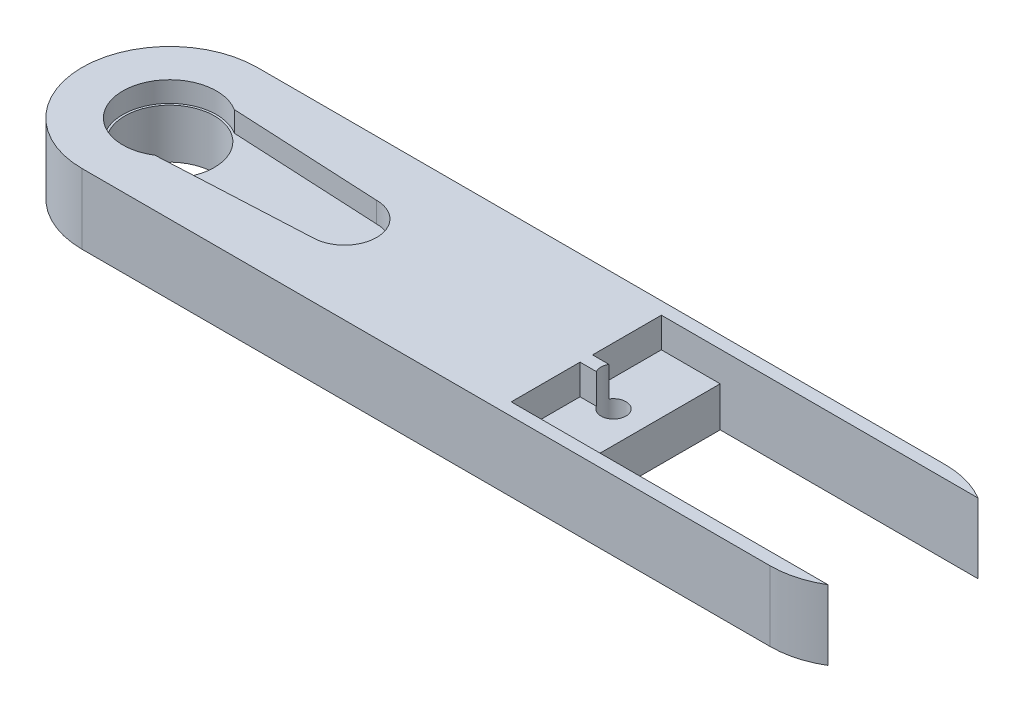
ISO-10303-21;
HEADER;
FILE_DESCRIPTION(('STEP AP214'),'2;1');
FILE_NAME('part.step','',(''),(''),'','','');
FILE_SCHEMA(('AUTOMOTIVE_DESIGN { 1 0 10303 214 1 1 1 1 }'));
ENDSEC;
DATA;
#1=APPLICATION_CONTEXT('core data for automotive mechanical design processes');
#2=APPLICATION_PROTOCOL_DEFINITION('international standard','automotive_design',2000,#1);
#3=PRODUCT_CONTEXT('',#1,'mechanical');
#4=PRODUCT('Part','Part','',(#3));
#5=PRODUCT_RELATED_PRODUCT_CATEGORY('part','',(#4));
#6=PRODUCT_DEFINITION_FORMATION('','',#4);
#7=PRODUCT_DEFINITION_CONTEXT('part definition',#1,'design');
#8=PRODUCT_DEFINITION('design','',#6,#7);
#9=PRODUCT_DEFINITION_SHAPE('','',#8);
#10=(LENGTH_UNIT() NAMED_UNIT(*) SI_UNIT(.MILLI.,.METRE.));
#11=(NAMED_UNIT(*) PLANE_ANGLE_UNIT() SI_UNIT($,.RADIAN.));
#12=(NAMED_UNIT(*) SI_UNIT($,.STERADIAN.) SOLID_ANGLE_UNIT());
#13=UNCERTAINTY_MEASURE_WITH_UNIT(LENGTH_MEASURE(1.E-05),#10,'distance_accuracy_value','');
#14=(GEOMETRIC_REPRESENTATION_CONTEXT(3) GLOBAL_UNCERTAINTY_ASSIGNED_CONTEXT((#13)) GLOBAL_UNIT_ASSIGNED_CONTEXT((#10,
#11,#12)) REPRESENTATION_CONTEXT('',''));
#15=CARTESIAN_POINT('',(0.,0.,0.));
#16=DIRECTION('',(0.,0.,1.));
#17=DIRECTION('',(1.,0.,0.));
#18=AXIS2_PLACEMENT_3D('',#15,#16,#17);
#19=CARTESIAN_POINT('',(55.,3.95,0.));
#20=DIRECTION('',(0.,-1.,0.));
#21=DIRECTION('',(0.,0.,-1.));
#22=AXIS2_PLACEMENT_3D('',#19,#20,#21);
#23=CYLINDRICAL_SURFACE('',#22,7.);
#24=CARTESIAN_POINT('',(55.,0.,0.));
#25=DIRECTION('',(0.,1.,0.));
#26=DIRECTION('',(0.,0.,1.));
#27=AXIS2_PLACEMENT_3D('',#24,#25,#26);
#28=CIRCLE('',#27,7.);
#29=CARTESIAN_POINT('',(55.,0.,7.));
#30=VERTEX_POINT('',#29);
#31=CARTESIAN_POINT('',(58.605551275464,0.,6.));
#32=VERTEX_POINT('',#31);
#33=EDGE_CURVE('E41',#30,#32,#28,.T.);
#34=ORIENTED_EDGE('',*,*,#33,.T.);
#35=DIRECTION('',(0.,-1.,0.));
#36=VECTOR('',#35,1.);
#37=CARTESIAN_POINT('',(58.605551275464,3.95,6.));
#38=LINE('',#37,#36);
#39=CARTESIAN_POINT('',(58.605551275464,5.59,6.));
#40=VERTEX_POINT('',#39);
#41=EDGE_CURVE('E148',#32,#40,#38,.F.);
#42=ORIENTED_EDGE('',*,*,#41,.T.);
#43=CARTESIAN_POINT('',(55.,5.59,0.));
#44=DIRECTION('',(0.,1.,0.));
#45=DIRECTION('',(0.,0.,1.));
#46=AXIS2_PLACEMENT_3D('',#43,#44,#45);
#47=CIRCLE('',#46,7.);
#48=CARTESIAN_POINT('',(55.,5.59,7.));
#49=VERTEX_POINT('',#48);
#50=EDGE_CURVE('E204',#49,#40,#47,.T.);
#51=ORIENTED_EDGE('',*,*,#50,.F.);
#52=DIRECTION('',(0.,-1.,0.));
#53=VECTOR('',#52,1.);
#54=CARTESIAN_POINT('',(55.,3.95,7.));
#55=LINE('',#54,#53);
#56=EDGE_CURVE('E135',#49,#30,#55,.T.);
#57=ORIENTED_EDGE('',*,*,#56,.T.);
#58=EDGE_LOOP('',(#34,#42,#51,#57));
#59=FACE_BOUND('',#58,.T.);
#60=ADVANCED_FACE('F38',(#59),#23,.T.);
#61=CARTESIAN_POINT('',(58.605551275464,5.59,-6.));
#62=VERTEX_POINT('',#61);
#63=CARTESIAN_POINT('',(55.,5.59,-7.));
#64=VERTEX_POINT('',#63);
#65=EDGE_CURVE('E133',#62,#64,#47,.T.);
#66=ORIENTED_EDGE('',*,*,#65,.F.);
#67=DIRECTION('',(0.,-1.,0.));
#68=VECTOR('',#67,1.);
#69=CARTESIAN_POINT('',(58.605551275464,3.95,-6.));
#70=LINE('',#69,#68);
#71=CARTESIAN_POINT('',(58.605551275464,0.,-6.));
#72=VERTEX_POINT('',#71);
#73=EDGE_CURVE('E114',#62,#72,#70,.T.);
#74=ORIENTED_EDGE('',*,*,#73,.T.);
#75=CARTESIAN_POINT('',(55.,0.,-7.));
#76=VERTEX_POINT('',#75);
#77=EDGE_CURVE('E130',#72,#76,#28,.T.);
#78=ORIENTED_EDGE('',*,*,#77,.T.);
#79=DIRECTION('',(0.,-1.,0.));
#80=VECTOR('',#79,1.);
#81=CARTESIAN_POINT('',(55.,3.95,-7.));
#82=LINE('',#81,#80);
#83=EDGE_CURVE('E166',#64,#76,#82,.T.);
#84=ORIENTED_EDGE('',*,*,#83,.F.);
#85=EDGE_LOOP('',(#66,#74,#78,#84));
#86=FACE_BOUND('',#85,.T.);
#87=ADVANCED_FACE('F127',(#86),#23,.T.);
#88=CARTESIAN_POINT('',(0.,5.59,0.));
#89=DIRECTION('',(0.,1.,0.));
#90=DIRECTION('',(0.,0.,1.));
#91=AXIS2_PLACEMENT_3D('',#88,#89,#90);
#92=PLANE('',#91);
#93=CARTESIAN_POINT('',(35.4716453696186,5.59,0.));
#94=DIRECTION('',(0.,1.,0.));
#95=DIRECTION('',(0.,0.,1.));
#96=AXIS2_PLACEMENT_3D('',#93,#94,#95);
#97=CIRCLE('',#96,1.00000000000001);
#98=CARTESIAN_POINT('',(34.6056199658342,5.59,-0.5));
#99=VERTEX_POINT('',#98);
#100=CARTESIAN_POINT('',(34.6056199658342,5.59,0.5));
#101=VERTEX_POINT('',#100);
#102=EDGE_CURVE('E157',#99,#101,#97,.T.);
#103=ORIENTED_EDGE('',*,*,#102,.F.);
#104=DIRECTION('',(1.,0.,0.));
#105=VECTOR('',#104,1.);
#106=CARTESIAN_POINT('',(49.5,5.59,-0.499999999999996));
#107=LINE('',#106,#105);
#108=CARTESIAN_POINT('',(33.3,5.59,-0.5));
#109=VERTEX_POINT('',#108);
#110=EDGE_CURVE('E276',#109,#99,#107,.T.);
#111=ORIENTED_EDGE('',*,*,#110,.F.);
#112=DIRECTION('',(0.,0.,-1.));
#113=VECTOR('',#112,1.);
#114=CARTESIAN_POINT('',(33.3,5.59,0.));
#115=LINE('',#114,#113);
#116=CARTESIAN_POINT('',(33.3,5.59,-6.));
#117=VERTEX_POINT('',#116);
#118=EDGE_CURVE('E317',#109,#117,#115,.T.);
#119=ORIENTED_EDGE('',*,*,#118,.T.);
#120=DIRECTION('',(-1.,0.,0.));
#121=VECTOR('',#120,1.);
#122=CARTESIAN_POINT('',(0.,5.59,-6.));
#123=LINE('',#122,#121);
#124=EDGE_CURVE('E167',#62,#117,#123,.T.);
#125=ORIENTED_EDGE('',*,*,#124,.F.);
#126=ORIENTED_EDGE('',*,*,#65,.T.);
#127=DIRECTION('',(-1.,0.,0.));
#128=VECTOR('',#127,1.);
#129=CARTESIAN_POINT('',(55.,5.59,-7.));
#130=LINE('',#129,#128);
#131=CARTESIAN_POINT('',(0.,5.59,-7.));
#132=VERTEX_POINT('',#131);
#133=EDGE_CURVE('E205',#64,#132,#130,.T.);
#134=ORIENTED_EDGE('',*,*,#133,.T.);
#135=CARTESIAN_POINT('',(0.,5.59,0.));
#136=DIRECTION('',(0.,1.,0.));
#137=DIRECTION('',(0.,0.,1.));
#138=AXIS2_PLACEMENT_3D('',#135,#136,#137);
#139=CIRCLE('',#138,7.);
#140=CARTESIAN_POINT('',(0.,5.59,7.));
#141=VERTEX_POINT('',#140);
#142=EDGE_CURVE('E209',#132,#141,#139,.T.);
#143=ORIENTED_EDGE('',*,*,#142,.T.);
#144=DIRECTION('',(1.,0.,0.));
#145=VECTOR('',#144,1.);
#146=CARTESIAN_POINT('',(0.,5.59,7.));
#147=LINE('',#146,#145);
#148=EDGE_CURVE('E213',#141,#49,#147,.T.);
#149=ORIENTED_EDGE('',*,*,#148,.T.);
#150=ORIENTED_EDGE('',*,*,#50,.T.);
#151=DIRECTION('',(-1.,0.,0.));
#152=VECTOR('',#151,1.);
#153=CARTESIAN_POINT('',(49.5,5.59,6.));
#154=LINE('',#153,#152);
#155=CARTESIAN_POINT('',(33.3,5.59,6.));
#156=VERTEX_POINT('',#155);
#157=EDGE_CURVE('E102',#40,#156,#154,.T.);
#158=ORIENTED_EDGE('',*,*,#157,.T.);
#159=CARTESIAN_POINT('',(33.3,5.59,0.5));
#160=VERTEX_POINT('',#159);
#161=EDGE_CURVE('E144',#156,#160,#115,.T.);
#162=ORIENTED_EDGE('',*,*,#161,.T.);
#163=DIRECTION('',(1.,0.,0.));
#164=VECTOR('',#163,1.);
#165=CARTESIAN_POINT('',(49.5,5.59,0.499999999999996));
#166=LINE('',#165,#164);
#167=EDGE_CURVE('E314',#160,#101,#166,.T.);
#168=ORIENTED_EDGE('',*,*,#167,.T.);
#169=EDGE_LOOP('',(#103,#111,#119,#125,#126,#134,#143,#149,#150,#158,#162,#168));
#170=FACE_BOUND('',#169,.T.);
#171=DIRECTION('',(-0.99875866941023,0.,-0.0498108449828539));
#172=VECTOR('',#171,1.);
#173=CARTESIAN_POINT('',(13.9793089820932,5.59,-2.5699963876771));
#174=LINE('',#173,#172);
#175=CARTESIAN_POINT('',(13.9793089820932,5.59,-2.5699963876771));
#176=VERTEX_POINT('',#175);
#177=CARTESIAN_POINT('',(1.99792628223678,5.59,-3.16754093434442));
#178=VERTEX_POINT('',#177);
#179=EDGE_CURVE('E224',#176,#178,#174,.T.);
#180=ORIENTED_EDGE('',*,*,#179,.F.);
#181=CARTESIAN_POINT('',(13.975,5.59,0.));
#182=DIRECTION('',(0.,1.,0.));
#183=DIRECTION('',(0.,0.,1.));
#184=AXIS2_PLACEMENT_3D('',#181,#182,#183);
#185=CIRCLE('',#184,2.57);
#186=CARTESIAN_POINT('',(13.9793089820932,5.59,2.5699963876771));
#187=VERTEX_POINT('',#186);
#188=EDGE_CURVE('E198',#187,#176,#185,.T.);
#189=ORIENTED_EDGE('',*,*,#188,.F.);
#190=DIRECTION('',(0.99875866941023,0.,-0.0498108449828537));
#191=VECTOR('',#190,1.);
#192=CARTESIAN_POINT('',(1.99792628223678,5.59,3.16754093434442));
#193=LINE('',#192,#191);
#194=CARTESIAN_POINT('',(1.99792628223678,5.59,3.16754093434442));
#195=VERTEX_POINT('',#194);
#196=EDGE_CURVE('E234',#195,#187,#193,.T.);
#197=ORIENTED_EDGE('',*,*,#196,.F.);
#198=CARTESIAN_POINT('',(0.,5.59,0.));
#199=DIRECTION('',(0.,1.,0.));
#200=DIRECTION('',(0.,0.,-1.));
#201=AXIS2_PLACEMENT_3D('',#198,#199,#200);
#202=CIRCLE('',#201,3.745);
#203=EDGE_CURVE('E229',#178,#195,#202,.T.);
#204=ORIENTED_EDGE('',*,*,#203,.F.);
#205=EDGE_LOOP('',(#180,#189,#197,#204));
#206=FACE_BOUND('',#205,.T.);
#207=ADVANCED_FACE('F335',(#170,#206),#92,.T.);
#208=CARTESIAN_POINT('',(0.,3.95,0.));
#209=DIRECTION('',(0.,1.,0.));
#210=DIRECTION('',(0.,0.,1.));
#211=AXIS2_PLACEMENT_3D('',#208,#209,#210);
#212=PLANE('',#211);
#213=CARTESIAN_POINT('',(0.,3.95,0.));
#214=DIRECTION('',(0.,-1.,0.));
#215=DIRECTION('',(0.,0.,-1.));
#216=AXIS2_PLACEMENT_3D('',#213,#214,#215);
#217=CIRCLE('',#216,3.575);
#218=CARTESIAN_POINT('',(0.,3.95,-3.575));
#219=VERTEX_POINT('',#218);
#220=EDGE_CURVE('E199',#219,#219,#217,.T.);
#221=ORIENTED_EDGE('',*,*,#220,.T.);
#222=EDGE_LOOP('',(#221));
#223=FACE_BOUND('',#222,.T.);
#224=DIRECTION('',(0.99875866941023,0.,-0.0498108449828537));
#225=VECTOR('',#224,1.);
#226=CARTESIAN_POINT('',(1.99792628223678,3.95,3.16754093434442));
#227=LINE('',#226,#225);
#228=CARTESIAN_POINT('',(1.99792628223678,3.95,3.16754093434442));
#229=VERTEX_POINT('',#228);
#230=CARTESIAN_POINT('',(13.9793089820932,3.95,2.5699963876771));
#231=VERTEX_POINT('',#230);
#232=EDGE_CURVE('E203',#229,#231,#227,.T.);
#233=ORIENTED_EDGE('',*,*,#232,.T.);
#234=CARTESIAN_POINT('',(13.975,3.95,0.));
#235=DIRECTION('',(0.,1.,0.));
#236=DIRECTION('',(0.,0.,1.));
#237=AXIS2_PLACEMENT_3D('',#234,#235,#236);
#238=CIRCLE('',#237,2.57);
#239=CARTESIAN_POINT('',(13.9793089820932,3.95,-2.5699963876771));
#240=VERTEX_POINT('',#239);
#241=EDGE_CURVE('E243',#231,#240,#238,.T.);
#242=ORIENTED_EDGE('',*,*,#241,.T.);
#243=DIRECTION('',(-0.99875866941023,0.,-0.0498108449828539));
#244=VECTOR('',#243,1.);
#245=CARTESIAN_POINT('',(13.9793089820932,3.95,-2.5699963876771));
#246=LINE('',#245,#244);
#247=CARTESIAN_POINT('',(1.99792628223678,3.95,-3.16754093434442));
#248=VERTEX_POINT('',#247);
#249=EDGE_CURVE('E247',#240,#248,#246,.T.);
#250=ORIENTED_EDGE('',*,*,#249,.T.);
#251=CARTESIAN_POINT('',(0.,3.95,0.));
#252=DIRECTION('',(0.,1.,0.));
#253=DIRECTION('',(0.,0.,-1.));
#254=AXIS2_PLACEMENT_3D('',#251,#252,#253);
#255=CIRCLE('',#254,3.745);
#256=EDGE_CURVE('E194',#248,#229,#255,.T.);
#257=ORIENTED_EDGE('',*,*,#256,.T.);
#258=EDGE_LOOP('',(#233,#242,#250,#257));
#259=FACE_BOUND('',#258,.T.);
#260=ADVANCED_FACE('F395',(#223,#259),#212,.T.);
#261=CARTESIAN_POINT('',(0.,3.95,0.));
#262=DIRECTION('',(0.,-1.,0.));
#263=DIRECTION('',(0.,0.,-1.));
#264=AXIS2_PLACEMENT_3D('',#261,#262,#263);
#265=CYLINDRICAL_SURFACE('',#264,7.);
#266=CARTESIAN_POINT('',(0.,0.,0.));
#267=DIRECTION('',(0.,1.,0.));
#268=DIRECTION('',(0.,0.,1.));
#269=AXIS2_PLACEMENT_3D('',#266,#267,#268);
#270=CIRCLE('',#269,7.);
#271=CARTESIAN_POINT('',(0.,0.,-7.));
#272=VERTEX_POINT('',#271);
#273=CARTESIAN_POINT('',(0.,0.,7.));
#274=VERTEX_POINT('',#273);
#275=EDGE_CURVE('E185',#272,#274,#270,.T.);
#276=ORIENTED_EDGE('',*,*,#275,.T.);
#277=DIRECTION('',(0.,-1.,0.));
#278=VECTOR('',#277,1.);
#279=CARTESIAN_POINT('',(0.,3.95,7.));
#280=LINE('',#279,#278);
#281=EDGE_CURVE('E172',#141,#274,#280,.T.);
#282=ORIENTED_EDGE('',*,*,#281,.F.);
#283=ORIENTED_EDGE('',*,*,#142,.F.);
#284=DIRECTION('',(0.,-1.,0.));
#285=VECTOR('',#284,1.);
#286=CARTESIAN_POINT('',(0.,3.95,-7.));
#287=LINE('',#286,#285);
#288=EDGE_CURVE('E181',#132,#272,#287,.T.);
#289=ORIENTED_EDGE('',*,*,#288,.T.);
#290=EDGE_LOOP('',(#276,#282,#283,#289));
#291=FACE_BOUND('',#290,.T.);
#292=ADVANCED_FACE('F420',(#291),#265,.T.);
#293=CARTESIAN_POINT('',(0.,3.95,7.));
#294=DIRECTION('',(0.,0.,-1.));
#295=DIRECTION('',(-1.,0.,0.));
#296=AXIS2_PLACEMENT_3D('',#293,#294,#295);
#297=PLANE('',#296);
#298=DIRECTION('',(1.,0.,0.));
#299=VECTOR('',#298,1.);
#300=CARTESIAN_POINT('',(0.,0.,7.));
#301=LINE('',#300,#299);
#302=EDGE_CURVE('E176',#274,#30,#301,.T.);
#303=ORIENTED_EDGE('',*,*,#302,.T.);
#304=ORIENTED_EDGE('',*,*,#56,.F.);
#305=ORIENTED_EDGE('',*,*,#148,.F.);
#306=ORIENTED_EDGE('',*,*,#281,.T.);
#307=EDGE_LOOP('',(#303,#304,#305,#306));
#308=FACE_BOUND('',#307,.T.);
#309=ADVANCED_FACE('F548',(#308),#297,.F.);
#310=CARTESIAN_POINT('',(0.,3.95,-7.));
#311=DIRECTION('',(0.,0.,1.));
#312=DIRECTION('',(1.,0.,0.));
#313=AXIS2_PLACEMENT_3D('',#310,#311,#312);
#314=PLANE('',#313);
#315=DIRECTION('',(-1.,0.,0.));
#316=VECTOR('',#315,1.);
#317=CARTESIAN_POINT('',(0.,0.,-7.));
#318=LINE('',#317,#316);
#319=EDGE_CURVE('E141',#76,#272,#318,.T.);
#320=ORIENTED_EDGE('',*,*,#319,.T.);
#321=ORIENTED_EDGE('',*,*,#288,.F.);
#322=ORIENTED_EDGE('',*,*,#133,.F.);
#323=ORIENTED_EDGE('',*,*,#83,.T.);
#324=EDGE_LOOP('',(#320,#321,#322,#323));
#325=FACE_BOUND('',#324,.T.);
#326=ADVANCED_FACE('F512',(#325),#314,.F.);
#327=CARTESIAN_POINT('',(0.,0.,0.));
#328=DIRECTION('',(0.,1.,0.));
#329=DIRECTION('',(0.,0.,1.));
#330=AXIS2_PLACEMENT_3D('',#327,#328,#329);
#331=PLANE('',#330);
#332=CARTESIAN_POINT('',(35.4716453696186,0.,0.));
#333=DIRECTION('',(0.,1.,0.));
#334=DIRECTION('',(0.,0.,1.));
#335=AXIS2_PLACEMENT_3D('',#332,#333,#334);
#336=CIRCLE('',#335,1.00000000000001);
#337=CARTESIAN_POINT('',(35.4716453696186,0.,1.00000000000001));
#338=VERTEX_POINT('',#337);
#339=EDGE_CURVE('E149',#338,#338,#336,.T.);
#340=ORIENTED_EDGE('',*,*,#339,.T.);
#341=EDGE_LOOP('',(#340));
#342=FACE_BOUND('',#341,.T.);
#343=CARTESIAN_POINT('',(0.,0.,0.));
#344=DIRECTION('',(0.,-1.,0.));
#345=DIRECTION('',(0.,0.,-1.));
#346=AXIS2_PLACEMENT_3D('',#343,#344,#345);
#347=CIRCLE('',#346,3.575);
#348=CARTESIAN_POINT('',(0.,0.,-3.575));
#349=VERTEX_POINT('',#348);
#350=EDGE_CURVE('E121',#349,#349,#347,.T.);
#351=ORIENTED_EDGE('',*,*,#350,.F.);
#352=EDGE_LOOP('',(#351));
#353=FACE_BOUND('',#352,.T.);
#354=DIRECTION('',(0.,0.,1.));
#355=VECTOR('',#354,1.);
#356=CARTESIAN_POINT('',(38.,0.,0.));
#357=LINE('',#356,#355);
#358=CARTESIAN_POINT('',(38.,0.,-6.));
#359=VERTEX_POINT('',#358);
#360=CARTESIAN_POINT('',(38.,0.,6.));
#361=VERTEX_POINT('',#360);
#362=EDGE_CURVE('E56',#359,#361,#357,.T.);
#363=ORIENTED_EDGE('',*,*,#362,.T.);
#364=DIRECTION('',(1.,0.,0.));
#365=VECTOR('',#364,1.);
#366=CARTESIAN_POINT('',(0.,0.,6.));
#367=LINE('',#366,#365);
#368=EDGE_CURVE('E122',#361,#32,#367,.T.);
#369=ORIENTED_EDGE('',*,*,#368,.T.);
#370=ORIENTED_EDGE('',*,*,#33,.F.);
#371=ORIENTED_EDGE('',*,*,#302,.F.);
#372=ORIENTED_EDGE('',*,*,#275,.F.);
#373=ORIENTED_EDGE('',*,*,#319,.F.);
#374=ORIENTED_EDGE('',*,*,#77,.F.);
#375=DIRECTION('',(-1.,0.,0.));
#376=VECTOR('',#375,1.);
#377=CARTESIAN_POINT('',(0.,0.,-6.));
#378=LINE('',#377,#376);
#379=EDGE_CURVE('E110',#72,#359,#378,.T.);
#380=ORIENTED_EDGE('',*,*,#379,.T.);
#381=EDGE_LOOP('',(#363,#369,#370,#371,#372,#373,#374,#380));
#382=FACE_BOUND('',#381,.T.);
#383=ADVANCED_FACE('F138',(#342,#353,#382),#331,.F.);
#384=CARTESIAN_POINT('',(0.,3.95,0.));
#385=DIRECTION('',(0.,-1.,0.));
#386=DIRECTION('',(0.,0.,-1.));
#387=AXIS2_PLACEMENT_3D('',#384,#385,#386);
#388=CYLINDRICAL_SURFACE('',#387,3.575);
#389=ORIENTED_EDGE('',*,*,#220,.F.);
#390=EDGE_LOOP('',(#389));
#391=FACE_BOUND('',#390,.T.);
#392=ORIENTED_EDGE('',*,*,#350,.T.);
#393=EDGE_LOOP('',(#392));
#394=FACE_BOUND('',#393,.T.);
#395=ADVANCED_FACE('F425',(#391,#394),#388,.F.);
#396=CARTESIAN_POINT('',(13.975,5.59,0.));
#397=DIRECTION('',(0.,-1.,0.));
#398=DIRECTION('',(0.,0.,-1.));
#399=AXIS2_PLACEMENT_3D('',#396,#397,#398);
#400=CYLINDRICAL_SURFACE('',#399,2.57);
#401=ORIENTED_EDGE('',*,*,#241,.F.);
#402=DIRECTION('',(0.,-1.,0.));
#403=VECTOR('',#402,1.);
#404=CARTESIAN_POINT('',(13.9793089820932,5.59,2.5699963876771));
#405=LINE('',#404,#403);
#406=EDGE_CURVE('E235',#187,#231,#405,.T.);
#407=ORIENTED_EDGE('',*,*,#406,.F.);
#408=ORIENTED_EDGE('',*,*,#188,.T.);
#409=DIRECTION('',(0.,-1.,0.));
#410=VECTOR('',#409,1.);
#411=CARTESIAN_POINT('',(13.9793089820932,5.59,-2.5699963876771));
#412=LINE('',#411,#410);
#413=EDGE_CURVE('E220',#176,#240,#412,.T.);
#414=ORIENTED_EDGE('',*,*,#413,.T.);
#415=EDGE_LOOP('',(#401,#407,#408,#414));
#416=FACE_BOUND('',#415,.T.);
#417=ADVANCED_FACE('F383',(#416),#400,.F.);
#418=CARTESIAN_POINT('',(13.9793089820932,5.59,-2.5699963876771));
#419=DIRECTION('',(-0.0498108449828539,0.,0.99875866941023));
#420=DIRECTION('',(0.998758669410231,0.,0.0498108449828539));
#421=AXIS2_PLACEMENT_3D('',#418,#419,#420);
#422=PLANE('',#421);
#423=ORIENTED_EDGE('',*,*,#249,.F.);
#424=ORIENTED_EDGE('',*,*,#413,.F.);
#425=ORIENTED_EDGE('',*,*,#179,.T.);
#426=DIRECTION('',(0.,-1.,0.));
#427=VECTOR('',#426,1.);
#428=CARTESIAN_POINT('',(1.99792628223678,5.59,-3.16754093434442));
#429=LINE('',#428,#427);
#430=EDGE_CURVE('E225',#178,#248,#429,.T.);
#431=ORIENTED_EDGE('',*,*,#430,.T.);
#432=EDGE_LOOP('',(#423,#424,#425,#431));
#433=FACE_BOUND('',#432,.T.);
#434=ADVANCED_FACE('F387',(#433),#422,.T.);
#435=CARTESIAN_POINT('',(0.,5.59,0.));
#436=DIRECTION('',(0.,-1.,0.));
#437=DIRECTION('',(0.,0.,-1.));
#438=AXIS2_PLACEMENT_3D('',#435,#436,#437);
#439=CYLINDRICAL_SURFACE('',#438,3.745);
#440=ORIENTED_EDGE('',*,*,#256,.F.);
#441=ORIENTED_EDGE('',*,*,#430,.F.);
#442=ORIENTED_EDGE('',*,*,#203,.T.);
#443=DIRECTION('',(0.,-1.,0.));
#444=VECTOR('',#443,1.);
#445=CARTESIAN_POINT('',(1.99792628223678,5.59,3.16754093434442));
#446=LINE('',#445,#444);
#447=EDGE_CURVE('E230',#195,#229,#446,.T.);
#448=ORIENTED_EDGE('',*,*,#447,.T.);
#449=EDGE_LOOP('',(#440,#441,#442,#448));
#450=FACE_BOUND('',#449,.T.);
#451=ADVANCED_FACE('F392',(#450),#439,.F.);
#452=CARTESIAN_POINT('',(1.99792628223678,5.59,3.16754093434442));
#453=DIRECTION('',(-0.0498108449828537,0.,-0.99875866941023));
#454=DIRECTION('',(-0.998758669410231,0.,0.0498108449828537));
#455=AXIS2_PLACEMENT_3D('',#452,#453,#454);
#456=PLANE('',#455);
#457=ORIENTED_EDGE('',*,*,#232,.F.);
#458=ORIENTED_EDGE('',*,*,#447,.F.);
#459=ORIENTED_EDGE('',*,*,#196,.T.);
#460=ORIENTED_EDGE('',*,*,#406,.T.);
#461=EDGE_LOOP('',(#457,#458,#459,#460));
#462=FACE_BOUND('',#461,.T.);
#463=ADVANCED_FACE('F397',(#462),#456,.T.);
#464=CARTESIAN_POINT('',(49.5,3.19,0.));
#465=DIRECTION('',(0.,-1.,0.));
#466=DIRECTION('',(0.,0.,1.));
#467=AXIS2_PLACEMENT_3D('',#464,#465,#466);
#468=PLANE('',#467);
#469=CARTESIAN_POINT('',(35.4716453696186,3.19,0.));
#470=DIRECTION('',(0.,-1.,0.));
#471=DIRECTION('',(0.,0.,1.));
#472=AXIS2_PLACEMENT_3D('',#469,#470,#471);
#473=CIRCLE('',#472,1.);
#474=CARTESIAN_POINT('',(34.6056199658342,3.19,-0.500000000000001));
#475=VERTEX_POINT('',#474);
#476=CARTESIAN_POINT('',(34.6056199658342,3.19,0.5));
#477=VERTEX_POINT('',#476);
#478=EDGE_CURVE('E239',#475,#477,#473,.T.);
#479=ORIENTED_EDGE('',*,*,#478,.T.);
#480=DIRECTION('',(1.,0.,0.));
#481=VECTOR('',#480,1.);
#482=CARTESIAN_POINT('',(49.5,3.19,0.499999999999996));
#483=LINE('',#482,#481);
#484=CARTESIAN_POINT('',(33.3,3.19,0.5));
#485=VERTEX_POINT('',#484);
#486=EDGE_CURVE('E285',#485,#477,#483,.T.);
#487=ORIENTED_EDGE('',*,*,#486,.F.);
#488=DIRECTION('',(0.,0.,-1.));
#489=VECTOR('',#488,1.);
#490=CARTESIAN_POINT('',(33.3,3.19,0.));
#491=LINE('',#490,#489);
#492=CARTESIAN_POINT('',(33.3,3.19,6.));
#493=VERTEX_POINT('',#492);
#494=EDGE_CURVE('E280',#493,#485,#491,.T.);
#495=ORIENTED_EDGE('',*,*,#494,.F.);
#496=DIRECTION('',(-1.,0.,0.));
#497=VECTOR('',#496,1.);
#498=CARTESIAN_POINT('',(49.5,3.19,6.));
#499=LINE('',#498,#497);
#500=CARTESIAN_POINT('',(38.,3.19,6.));
#501=VERTEX_POINT('',#500);
#502=EDGE_CURVE('E48',#501,#493,#499,.T.);
#503=ORIENTED_EDGE('',*,*,#502,.F.);
#504=DIRECTION('',(0.,0.,-1.));
#505=VECTOR('',#504,1.);
#506=CARTESIAN_POINT('',(38.,3.19,0.));
#507=LINE('',#506,#505);
#508=CARTESIAN_POINT('',(38.,3.19,-6.));
#509=VERTEX_POINT('',#508);
#510=EDGE_CURVE('E297',#501,#509,#507,.T.);
#511=ORIENTED_EDGE('',*,*,#510,.T.);
#512=DIRECTION('',(-1.,0.,0.));
#513=VECTOR('',#512,1.);
#514=CARTESIAN_POINT('',(49.5,3.19,-6.));
#515=LINE('',#514,#513);
#516=CARTESIAN_POINT('',(33.3,3.19,-6.));
#517=VERTEX_POINT('',#516);
#518=EDGE_CURVE('E300',#509,#517,#515,.T.);
#519=ORIENTED_EDGE('',*,*,#518,.T.);
#520=CARTESIAN_POINT('',(33.3,3.19,-0.5));
#521=VERTEX_POINT('',#520);
#522=EDGE_CURVE('E275',#521,#517,#491,.T.);
#523=ORIENTED_EDGE('',*,*,#522,.F.);
#524=DIRECTION('',(1.,0.,0.));
#525=VECTOR('',#524,1.);
#526=CARTESIAN_POINT('',(49.5,3.19,-0.499999999999996));
#527=LINE('',#526,#525);
#528=EDGE_CURVE('E304',#521,#475,#527,.T.);
#529=ORIENTED_EDGE('',*,*,#528,.T.);
#530=EDGE_LOOP('',(#479,#487,#495,#503,#511,#519,#523,#529));
#531=FACE_BOUND('',#530,.T.);
#532=ADVANCED_FACE('F399',(#531),#468,.F.);
#533=CARTESIAN_POINT('',(49.5,5.59,-0.499999999999996));
#534=DIRECTION('',(0.,0.,-1.));
#535=DIRECTION('',(1.,0.,0.));
#536=AXIS2_PLACEMENT_3D('',#533,#534,#535);
#537=PLANE('',#536);
#538=ORIENTED_EDGE('',*,*,#528,.F.);
#539=DIRECTION('',(0.,-1.,0.));
#540=VECTOR('',#539,1.);
#541=CARTESIAN_POINT('',(33.3,5.59,-0.5));
#542=LINE('',#541,#540);
#543=EDGE_CURVE('E277',#109,#521,#542,.T.);
#544=ORIENTED_EDGE('',*,*,#543,.F.);
#545=ORIENTED_EDGE('',*,*,#110,.T.);
#546=DIRECTION('',(0.,-1.,0.));
#547=VECTOR('',#546,1.);
#548=CARTESIAN_POINT('',(34.6056199658342,5.59,-0.5));
#549=LINE('',#548,#547);
#550=EDGE_CURVE('E271',#99,#475,#549,.T.);
#551=ORIENTED_EDGE('',*,*,#550,.T.);
#552=EDGE_LOOP('',(#538,#544,#545,#551));
#553=FACE_BOUND('',#552,.T.);
#554=ADVANCED_FACE('F328',(#553),#537,.T.);
#555=CARTESIAN_POINT('',(33.3,5.59,0.));
#556=DIRECTION('',(-1.,0.,0.));
#557=DIRECTION('',(0.,0.,-1.));
#558=AXIS2_PLACEMENT_3D('',#555,#556,#557);
#559=PLANE('',#558);
#560=ORIENTED_EDGE('',*,*,#522,.T.);
#561=DIRECTION('',(0.,-1.,0.));
#562=VECTOR('',#561,1.);
#563=CARTESIAN_POINT('',(33.3,5.59,-6.));
#564=LINE('',#563,#562);
#565=EDGE_CURVE('E170',#117,#517,#564,.T.);
#566=ORIENTED_EDGE('',*,*,#565,.F.);
#567=ORIENTED_EDGE('',*,*,#118,.F.);
#568=ORIENTED_EDGE('',*,*,#543,.T.);
#569=EDGE_LOOP('',(#560,#566,#567,#568));
#570=FACE_BOUND('',#569,.T.);
#571=ADVANCED_FACE('F448',(#570),#559,.F.);
#572=ORIENTED_EDGE('',*,*,#494,.T.);
#573=DIRECTION('',(0.,-1.,0.));
#574=VECTOR('',#573,1.);
#575=CARTESIAN_POINT('',(33.3,5.59,0.5));
#576=LINE('',#575,#574);
#577=EDGE_CURVE('E286',#160,#485,#576,.T.);
#578=ORIENTED_EDGE('',*,*,#577,.F.);
#579=ORIENTED_EDGE('',*,*,#161,.F.);
#580=DIRECTION('',(0.,-1.,0.));
#581=VECTOR('',#580,1.);
#582=CARTESIAN_POINT('',(33.3,5.59,6.));
#583=LINE('',#582,#581);
#584=EDGE_CURVE('E97',#156,#493,#583,.T.);
#585=ORIENTED_EDGE('',*,*,#584,.T.);
#586=EDGE_LOOP('',(#572,#578,#579,#585));
#587=FACE_BOUND('',#586,.T.);
#588=ADVANCED_FACE('F453',(#587),#559,.F.);
#589=CARTESIAN_POINT('',(49.5,5.59,0.499999999999996));
#590=DIRECTION('',(0.,0.,-1.));
#591=DIRECTION('',(1.,0.,0.));
#592=AXIS2_PLACEMENT_3D('',#589,#590,#591);
#593=PLANE('',#592);
#594=ORIENTED_EDGE('',*,*,#486,.T.);
#595=DIRECTION('',(0.,-1.,0.));
#596=VECTOR('',#595,1.);
#597=CARTESIAN_POINT('',(34.6056199658342,5.59,0.5));
#598=LINE('',#597,#596);
#599=EDGE_CURVE('E171',#101,#477,#598,.T.);
#600=ORIENTED_EDGE('',*,*,#599,.F.);
#601=ORIENTED_EDGE('',*,*,#167,.F.);
#602=ORIENTED_EDGE('',*,*,#577,.T.);
#603=EDGE_LOOP('',(#594,#600,#601,#602));
#604=FACE_BOUND('',#603,.T.);
#605=ADVANCED_FACE('F464',(#604),#593,.F.);
#606=CARTESIAN_POINT('',(61.,21.79,-6.));
#607=DIRECTION('',(0.,0.,-1.));
#608=DIRECTION('',(1.,0.,0.));
#609=AXIS2_PLACEMENT_3D('',#606,#607,#608);
#610=PLANE('',#609);
#611=ORIENTED_EDGE('',*,*,#73,.F.);
#612=ORIENTED_EDGE('',*,*,#124,.T.);
#613=ORIENTED_EDGE('',*,*,#565,.T.);
#614=ORIENTED_EDGE('',*,*,#518,.F.);
#615=DIRECTION('',(0.,-1.,0.));
#616=VECTOR('',#615,1.);
#617=CARTESIAN_POINT('',(38.,21.79,-6.));
#618=LINE('',#617,#616);
#619=EDGE_CURVE('E117',#509,#359,#618,.T.);
#620=ORIENTED_EDGE('',*,*,#619,.T.);
#621=ORIENTED_EDGE('',*,*,#379,.F.);
#622=EDGE_LOOP('',(#611,#612,#613,#614,#620,#621));
#623=FACE_BOUND('',#622,.T.);
#624=ADVANCED_FACE('F112',(#623),#610,.F.);
#625=CARTESIAN_POINT('',(61.,21.79,6.));
#626=DIRECTION('',(0.,0.,1.));
#627=DIRECTION('',(-1.,0.,0.));
#628=AXIS2_PLACEMENT_3D('',#625,#626,#627);
#629=PLANE('',#628);
#630=DIRECTION('',(0.,-1.,0.));
#631=VECTOR('',#630,1.);
#632=CARTESIAN_POINT('',(38.,21.79,6.));
#633=LINE('',#632,#631);
#634=EDGE_CURVE('E11',#501,#361,#633,.T.);
#635=ORIENTED_EDGE('',*,*,#634,.F.);
#636=ORIENTED_EDGE('',*,*,#502,.T.);
#637=ORIENTED_EDGE('',*,*,#584,.F.);
#638=ORIENTED_EDGE('',*,*,#157,.F.);
#639=ORIENTED_EDGE('',*,*,#41,.F.);
#640=ORIENTED_EDGE('',*,*,#368,.F.);
#641=EDGE_LOOP('',(#635,#636,#637,#638,#639,#640));
#642=FACE_BOUND('',#641,.T.);
#643=ADVANCED_FACE('F475',(#642),#629,.F.);
#644=CARTESIAN_POINT('',(38.,21.79,6.));
#645=DIRECTION('',(-1.,0.,0.));
#646=DIRECTION('',(0.,0.,-1.));
#647=AXIS2_PLACEMENT_3D('',#644,#645,#646);
#648=PLANE('',#647);
#649=ORIENTED_EDGE('',*,*,#619,.F.);
#650=ORIENTED_EDGE('',*,*,#510,.F.);
#651=ORIENTED_EDGE('',*,*,#634,.T.);
#652=ORIENTED_EDGE('',*,*,#362,.F.);
#653=EDGE_LOOP('',(#649,#650,#651,#652));
#654=FACE_BOUND('',#653,.T.);
#655=ADVANCED_FACE('F486',(#654),#648,.F.);
#656=CARTESIAN_POINT('',(35.4716453696186,-4.41,0.));
#657=DIRECTION('',(0.,1.,0.));
#658=DIRECTION('',(0.,0.,1.));
#659=AXIS2_PLACEMENT_3D('',#656,#657,#658);
#660=CYLINDRICAL_SURFACE('',#659,1.00000000000001);
#661=ORIENTED_EDGE('',*,*,#550,.F.);
#662=ORIENTED_EDGE('',*,*,#102,.T.);
#663=ORIENTED_EDGE('',*,*,#599,.T.);
#664=ORIENTED_EDGE('',*,*,#478,.F.);
#665=EDGE_LOOP('',(#661,#662,#663,#664));
#666=FACE_BOUND('',#665,.T.);
#667=ORIENTED_EDGE('',*,*,#339,.F.);
#668=EDGE_LOOP('',(#667));
#669=FACE_BOUND('',#668,.T.);
#670=ADVANCED_FACE('F495',(#666,#669),#660,.F.);
#671=CLOSED_SHELL('',(#60,#87,#207,#260,#292,#309,#326,#383,#395,#417,#434,#451,#463,#532,#554,
#571,#588,#605,#624,#643,#655,#670));
#672=MANIFOLD_SOLID_BREP('B2',#671);
#673=ADVANCED_BREP_SHAPE_REPRESENTATION('',(#18,#672),#14);
#674=SHAPE_DEFINITION_REPRESENTATION(#9,#673);
ENDSEC;
END-ISO-10303-21;
